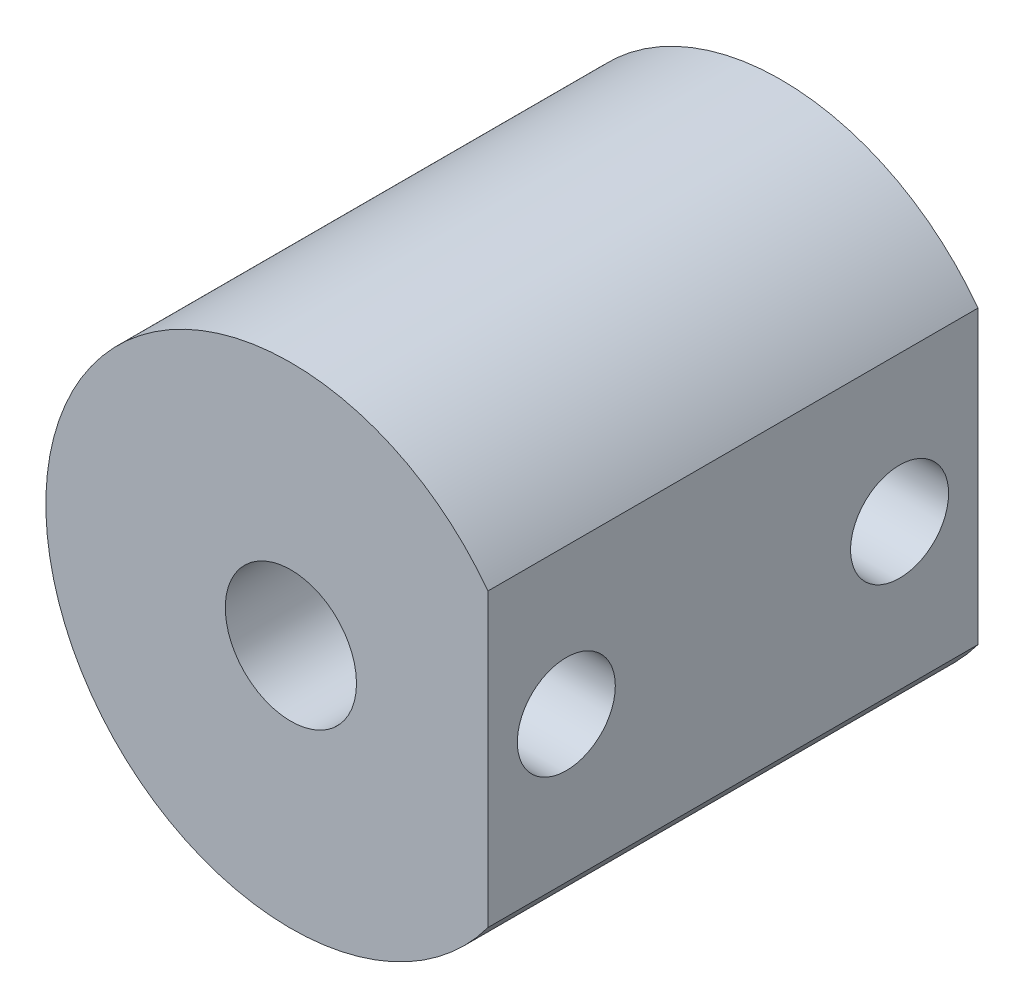
ISO-10303-21;
HEADER;
FILE_DESCRIPTION(('STEP AP214'),'2;1');
FILE_NAME('part.step','',(''),(''),'','','');
FILE_SCHEMA(('AUTOMOTIVE_DESIGN { 1 0 10303 214 1 1 1 1 }'));
ENDSEC;
DATA;
#1=APPLICATION_CONTEXT('core data for automotive mechanical design processes');
#2=APPLICATION_PROTOCOL_DEFINITION('international standard','automotive_design',2000,#1);
#3=PRODUCT_CONTEXT('',#1,'mechanical');
#4=PRODUCT('Part','Part','',(#3));
#5=PRODUCT_RELATED_PRODUCT_CATEGORY('part','',(#4));
#6=PRODUCT_DEFINITION_FORMATION('','',#4);
#7=PRODUCT_DEFINITION_CONTEXT('part definition',#1,'design');
#8=PRODUCT_DEFINITION('design','',#6,#7);
#9=PRODUCT_DEFINITION_SHAPE('','',#8);
#10=(LENGTH_UNIT() NAMED_UNIT(*) SI_UNIT(.MILLI.,.METRE.));
#11=(NAMED_UNIT(*) PLANE_ANGLE_UNIT() SI_UNIT($,.RADIAN.));
#12=(NAMED_UNIT(*) SI_UNIT($,.STERADIAN.) SOLID_ANGLE_UNIT());
#13=UNCERTAINTY_MEASURE_WITH_UNIT(LENGTH_MEASURE(1.E-05),#10,'distance_accuracy_value','');
#14=(GEOMETRIC_REPRESENTATION_CONTEXT(3) GLOBAL_UNCERTAINTY_ASSIGNED_CONTEXT((#13)) GLOBAL_UNIT_ASSIGNED_CONTEXT((#10,
#11,#12)) REPRESENTATION_CONTEXT('',''));
#15=CARTESIAN_POINT('',(0.,0.,0.));
#16=DIRECTION('',(0.,0.,1.));
#17=DIRECTION('',(1.,0.,0.));
#18=AXIS2_PLACEMENT_3D('',#15,#16,#17);
#19=CARTESIAN_POINT('',(0.,0.,6.35));
#20=DIRECTION('',(0.,0.,1.));
#21=DIRECTION('',(1.,0.,0.));
#22=AXIS2_PLACEMENT_3D('',#19,#20,#21);
#23=CYLINDRICAL_SURFACE('',#22,1.7);
#24=CARTESIAN_POINT('',(0.,0.,12.7));
#25=DIRECTION('',(0.,0.,1.));
#26=DIRECTION('',(1.,0.,0.));
#27=AXIS2_PLACEMENT_3D('',#24,#25,#26);
#28=CIRCLE('',#27,1.7);
#29=CARTESIAN_POINT('',(1.7,0.,12.7));
#30=VERTEX_POINT('',#29);
#31=EDGE_CURVE('E208',#30,#30,#28,.T.);
#32=ORIENTED_EDGE('',*,*,#31,.T.);
#33=EDGE_LOOP('',(#32));
#34=FACE_BOUND('',#33,.T.);
#35=CARTESIAN_POINT('',(0.,0.,6.35));
#36=DIRECTION('',(0.,0.,1.));
#37=DIRECTION('',(1.,0.,0.));
#38=AXIS2_PLACEMENT_3D('',#35,#36,#37);
#39=CIRCLE('',#38,1.7);
#40=CARTESIAN_POINT('',(1.7,0.,6.35));
#41=VERTEX_POINT('',#40);
#42=EDGE_CURVE('E211',#41,#41,#39,.T.);
#43=ORIENTED_EDGE('',*,*,#42,.F.);
#44=EDGE_LOOP('',(#43));
#45=FACE_BOUND('',#44,.T.);
#46=DIRECTION('',(0.,0.,1.));
#47=VECTOR('',#46,1.);
#48=CARTESIAN_POINT('',(1.2951946017097,1.10112258341297,6.35));
#49=LINE('',#48,#47);
#50=CARTESIAN_POINT('',(1.2951946017097,1.10112258341297,11.3007946399093));
#51=VERTEX_POINT('',#50);
#52=CARTESIAN_POINT('',(1.2951946017097,1.10112258341297,10.0352053600907));
#53=VERTEX_POINT('',#52);
#54=EDGE_CURVE('E11',#51,#53,#49,.F.);
#55=ORIENTED_EDGE('',*,*,#54,.F.);
#56=CARTESIAN_POINT('',(1.2951946017097,1.10112258341297,11.3007946399093));
#57=CARTESIAN_POINT('',(1.3113173687256,1.08216613180387,11.3337619197842));
#58=CARTESIAN_POINT('',(1.32787279571371,1.06184189359938,11.3657178927191));
#59=CARTESIAN_POINT('',(1.36137730272647,1.01852680407991,11.4275624808981));
#60=CARTESIAN_POINT('',(1.37832646814451,0.995535369906923,11.45745064198));
#61=CARTESIAN_POINT('',(1.41232141435796,0.946701619108911,11.5154108652147));
#62=CARTESIAN_POINT('',(1.42936626934783,0.920831262074049,11.5434598977748));
#63=CARTESIAN_POINT('',(1.46293509373535,0.866511129944811,11.5972581339285));
#64=CARTESIAN_POINT('',(1.47945908547812,0.838061465706677,11.6230074362681));
#65=CARTESIAN_POINT('',(1.52774249560604,0.748722638253251,11.696730436916));
#66=CARTESIAN_POINT('',(1.55813524484959,0.683951000967624,11.7410508948931));
#67=CARTESIAN_POINT('',(1.61184761600013,0.545361428989942,11.8176482286547));
#68=CARTESIAN_POINT('',(1.6352037706125,0.471593113324176,11.8499875170762));
#69=CARTESIAN_POINT('',(1.66668877775104,0.339598467941695,11.8931109365594));
#70=CARTESIAN_POINT('',(1.67727138425101,0.283103462620614,11.9074298176562));
#71=CARTESIAN_POINT('',(1.69268433558115,0.167893711182328,11.9282104668643));
#72=CARTESIAN_POINT('',(1.69751575531143,0.109179381975218,11.9346737032049));
#73=CARTESIAN_POINT('',(1.70100385596444,-0.00885758387635066,11.9393443321602));
#74=CARTESIAN_POINT('',(1.6996506015261,-0.0681810464494508,11.9375384408375));
#75=CARTESIAN_POINT('',(1.69086890222751,-0.185546160427944,11.9257570514304));
#76=CARTESIAN_POINT('',(1.68343948236335,-0.243587604580728,11.91578024221));
#77=CARTESIAN_POINT('',(1.66333003888365,-0.355691032554889,11.8885119373664));
#78=CARTESIAN_POINT('',(1.65075643217894,-0.409808915959445,11.8713685474691));
#79=CARTESIAN_POINT('',(1.62126304690074,-0.51425197559634,11.8305797762669));
#80=CARTESIAN_POINT('',(1.60434205153392,-0.564576084878069,11.8069325744754));
#81=CARTESIAN_POINT('',(1.56491177405399,-0.666630410538083,11.7507279904886));
#82=CARTESIAN_POINT('',(1.54197318693177,-0.717787690111496,11.7174368497656));
#83=CARTESIAN_POINT('',(1.49338732450105,-0.814069541165105,11.6446464234165));
#84=CARTESIAN_POINT('',(1.46773740934434,-0.859188134504203,11.6051410687988));
#85=CARTESIAN_POINT('',(1.41716784401171,-0.940071640037859,11.5237007181589));
#86=CARTESIAN_POINT('',(1.39233043272054,-0.976277877811575,11.4821505052677));
#87=CARTESIAN_POINT('',(1.34310354445216,-1.0429796213762,11.3946932034082));
#88=CARTESIAN_POINT('',(1.318712950277,-1.07349187716099,11.3487995117827));
#89=CARTESIAN_POINT('',(1.2951946017097,-1.10112258341297,11.3007946399093));
#90=B_SPLINE_CURVE_WITH_KNOTS('',3,(#56,#57,#58,#59,#60,#61,#62,#63,#64,#65,#66,#67,#68,#69,#70,
#71,#72,#73,#74,#75,#76,#77,#78,#79,#80,#81,#82,#83,#84,#85,#86,#87,#88,#89),.UNSPECIFIED.,.F.,
.F.,(4,2,2,2,2,2,2,2,2,2,2,2,2,2,2,2,4),(0.,0.123863180300836,0.247753479391506,
0.372978247877537,0.49819763686777,0.749183258251209,0.998842415639397,1.17578456463396,
1.35269363784413,1.52988700619039,1.70710881321811,1.88083625812305,2.05461238078352,
2.24951645474449,2.44461207353285,2.625539738844,2.80592647678083),.UNSPECIFIED.);
#91=CARTESIAN_POINT('',(1.2951946017097,-1.10112258341297,11.3007946399093));
#92=VERTEX_POINT('',#91);
#93=EDGE_CURVE('E126',#51,#92,#90,.T.);
#94=ORIENTED_EDGE('',*,*,#93,.T.);
#95=DIRECTION('',(0.,0.,1.));
#96=VECTOR('',#95,1.);
#97=CARTESIAN_POINT('',(1.2951946017097,-1.10112258341297,6.35));
#98=LINE('',#97,#96);
#99=CARTESIAN_POINT('',(1.2951946017097,-1.10112258341297,10.0352053600907));
#100=VERTEX_POINT('',#99);
#101=EDGE_CURVE('E48',#100,#92,#98,.T.);
#102=ORIENTED_EDGE('',*,*,#101,.F.);
#103=CARTESIAN_POINT('',(1.2951946017097,-1.10112258341297,10.0352053600907));
#104=CARTESIAN_POINT('',(1.3113173687256,-1.08216613180387,10.0022380802159));
#105=CARTESIAN_POINT('',(1.32787279571371,-1.06184189359938,9.97028210728091));
#106=CARTESIAN_POINT('',(1.36137730272647,-1.01852680407991,9.90843751910186));
#107=CARTESIAN_POINT('',(1.37832646814451,-0.995535369906923,9.87854935801997));
#108=CARTESIAN_POINT('',(1.41232141435796,-0.946701619108911,9.82058913478527));
#109=CARTESIAN_POINT('',(1.42936626934783,-0.920831262074049,9.79254010222524));
#110=CARTESIAN_POINT('',(1.46293509373535,-0.866511129944811,9.73874186607155));
#111=CARTESIAN_POINT('',(1.47945908547812,-0.838061465706677,9.71299256373194));
#112=CARTESIAN_POINT('',(1.52774249560604,-0.748722638253251,9.63926956308404));
#113=CARTESIAN_POINT('',(1.55813524484959,-0.683951000967624,9.59494910510688));
#114=CARTESIAN_POINT('',(1.61184761600013,-0.545361428989942,9.51835177134534));
#115=CARTESIAN_POINT('',(1.6352037706125,-0.471593113324176,9.48601248292378));
#116=CARTESIAN_POINT('',(1.66668877775104,-0.339598467941695,9.44288906344059));
#117=CARTESIAN_POINT('',(1.67727138425101,-0.283103462620614,9.42857018234377));
#118=CARTESIAN_POINT('',(1.69268433558115,-0.167893711182328,9.40778953313566));
#119=CARTESIAN_POINT('',(1.69751575531143,-0.109179381975218,9.40132629679508));
#120=CARTESIAN_POINT('',(1.70100385596444,0.00885758387635066,9.39665566783984));
#121=CARTESIAN_POINT('',(1.6996506015261,0.0681810464494508,9.39846155916254));
#122=CARTESIAN_POINT('',(1.69086890222751,0.185546160427944,9.4102429485696));
#123=CARTESIAN_POINT('',(1.68343948236335,0.243587604580728,9.42021975778995));
#124=CARTESIAN_POINT('',(1.66333003888365,0.355691032554889,9.44748806263355));
#125=CARTESIAN_POINT('',(1.65075643217894,0.409808915959445,9.46463145253094));
#126=CARTESIAN_POINT('',(1.62126304690074,0.51425197559634,9.50542022373306));
#127=CARTESIAN_POINT('',(1.60434205153392,0.564576084878069,9.52906742552461));
#128=CARTESIAN_POINT('',(1.56491177405399,0.666630410538083,9.58527200951145));
#129=CARTESIAN_POINT('',(1.54197318693177,0.717787690111496,9.61856315023443));
#130=CARTESIAN_POINT('',(1.49338732450105,0.814069541165105,9.69135357658346));
#131=CARTESIAN_POINT('',(1.46773740934434,0.859188134504203,9.73085893120118));
#132=CARTESIAN_POINT('',(1.41716784401171,0.940071640037859,9.8122992818411));
#133=CARTESIAN_POINT('',(1.39233043272054,0.976277877811575,9.8538494947323));
#134=CARTESIAN_POINT('',(1.34310354445216,1.0429796213762,9.94130679659184));
#135=CARTESIAN_POINT('',(1.318712950277,1.07349187716099,9.98720048821733));
#136=CARTESIAN_POINT('',(1.2951946017097,1.10112258341297,10.0352053600907));
#137=B_SPLINE_CURVE_WITH_KNOTS('',3,(#103,#104,#105,#106,#107,#108,#109,#110,#111,#112,#113,
#114,#115,#116,#117,#118,#119,#120,#121,#122,#123,#124,#125,#126,#127,#128,#129,#130,#131,#132,
#133,#134,#135,#136),.UNSPECIFIED.,.F.,.F.,(4,2,2,2,2,2,2,2,2,2,2,2,2,2,2,2,4),(0.,
0.123863180300834,0.247753479391506,0.372978247877537,0.49819763686777,0.749183258251209,
0.998842415639397,1.17578456463396,1.35269363784413,1.52988700619039,1.70710881321811,
1.88083625812305,2.05461238078352,2.24951645474449,2.44461207353285,2.625539738844,
2.80592647678083),.UNSPECIFIED.);
#138=EDGE_CURVE('E124',#100,#53,#137,.T.);
#139=ORIENTED_EDGE('',*,*,#138,.T.);
#140=EDGE_LOOP('',(#55,#94,#102,#139));
#141=FACE_BOUND('',#140,.T.);
#142=ADVANCED_FACE('F39',(#34,#45,#141),#23,.F.);
#143=CARTESIAN_POINT('',(0.,0.,12.7));
#144=DIRECTION('',(0.,0.,-1.));
#145=DIRECTION('',(-1.,0.,0.));
#146=AXIS2_PLACEMENT_3D('',#143,#144,#145);
#147=CYLINDRICAL_SURFACE('',#146,6.35);
#148=CARTESIAN_POINT('',(0.,0.,12.7));
#149=DIRECTION('',(0.,0.,1.));
#150=DIRECTION('',(1.,0.,0.));
#151=AXIS2_PLACEMENT_3D('',#148,#149,#150);
#152=CIRCLE('',#151,6.35);
#153=CARTESIAN_POINT('',(5.1051946017097,3.77617373523441,12.7));
#154=VERTEX_POINT('',#153);
#155=CARTESIAN_POINT('',(5.1051946017097,-3.77617373523441,12.7));
#156=VERTEX_POINT('',#155);
#157=EDGE_CURVE('E226',#154,#156,#152,.T.);
#158=ORIENTED_EDGE('',*,*,#157,.F.);
#159=DIRECTION('',(0.,0.,-1.));
#160=VECTOR('',#159,1.);
#161=CARTESIAN_POINT('',(5.1051946017097,3.77617373523441,12.7));
#162=LINE('',#161,#160);
#163=CARTESIAN_POINT('',(5.1051946017097,3.77617373523441,0.));
#164=VERTEX_POINT('',#163);
#165=EDGE_CURVE('E247',#154,#164,#162,.T.);
#166=ORIENTED_EDGE('',*,*,#165,.T.);
#167=CARTESIAN_POINT('',(0.,0.,0.));
#168=DIRECTION('',(0.,0.,1.));
#169=DIRECTION('',(1.,0.,0.));
#170=AXIS2_PLACEMENT_3D('',#167,#168,#169);
#171=CIRCLE('',#170,6.35);
#172=CARTESIAN_POINT('',(5.1051946017097,-3.77617373523441,0.));
#173=VERTEX_POINT('',#172);
#174=EDGE_CURVE('E218',#164,#173,#171,.T.);
#175=ORIENTED_EDGE('',*,*,#174,.T.);
#176=DIRECTION('',(0.,0.,-1.));
#177=VECTOR('',#176,1.);
#178=CARTESIAN_POINT('',(5.1051946017097,-3.77617373523441,14.224));
#179=LINE('',#178,#177);
#180=EDGE_CURVE('E62',#156,#173,#179,.T.);
#181=ORIENTED_EDGE('',*,*,#180,.F.);
#182=EDGE_LOOP('',(#158,#166,#175,#181));
#183=FACE_BOUND('',#182,.T.);
#184=ADVANCED_FACE('F41',(#183),#147,.T.);
#185=CARTESIAN_POINT('',(0.,0.,12.7));
#186=DIRECTION('',(0.,0.,1.));
#187=DIRECTION('',(1.,0.,0.));
#188=AXIS2_PLACEMENT_3D('',#185,#186,#187);
#189=PLANE('',#188);
#190=DIRECTION('',(0.,-1.,0.));
#191=VECTOR('',#190,1.);
#192=CARTESIAN_POINT('',(5.1051946017097,0.,12.7));
#193=LINE('',#192,#191);
#194=EDGE_CURVE('E245',#154,#156,#193,.T.);
#195=ORIENTED_EDGE('',*,*,#194,.F.);
#196=ORIENTED_EDGE('',*,*,#157,.T.);
#197=EDGE_LOOP('',(#195,#196));
#198=FACE_BOUND('',#197,.T.);
#199=ORIENTED_EDGE('',*,*,#31,.F.);
#200=EDGE_LOOP('',(#199));
#201=FACE_BOUND('',#200,.T.);
#202=ADVANCED_FACE('F203',(#198,#201),#189,.T.);
#203=CARTESIAN_POINT('',(0.,0.,0.));
#204=DIRECTION('',(0.,0.,1.));
#205=DIRECTION('',(1.,0.,0.));
#206=AXIS2_PLACEMENT_3D('',#203,#204,#205);
#207=PLANE('',#206);
#208=DIRECTION('',(-0.867256587504201,-0.497861437983069,0.));
#209=VECTOR('',#208,1.);
#210=CARTESIAN_POINT('',(2.646216494923,-1.53651280350369,0.));
#211=LINE('',#210,#209);
#212=CARTESIAN_POINT('',(2.646216494923,-1.53651280350369,0.));
#213=VERTEX_POINT('',#212);
#214=CARTESIAN_POINT('',(-0.00755087361273812,-3.05994711026858,0.));
#215=VERTEX_POINT('',#214);
#216=EDGE_CURVE('E268',#213,#215,#211,.T.);
#217=ORIENTED_EDGE('',*,*,#216,.F.);
#218=DIRECTION('',(-0.00246764089411252,-0.999996955369574,0.));
#219=VECTOR('',#218,1.);
#220=CARTESIAN_POINT('',(2.65376736853574,1.52343430676489,0.));
#221=LINE('',#220,#219);
#222=CARTESIAN_POINT('',(2.65376736853574,1.52343430676489,0.));
#223=VERTEX_POINT('',#222);
#224=EDGE_CURVE('E273',#223,#213,#221,.T.);
#225=ORIENTED_EDGE('',*,*,#224,.F.);
#226=DIRECTION('',(0.864788946610088,-0.502135517386506,0.));
#227=VECTOR('',#226,1.);
#228=CARTESIAN_POINT('',(0.00755087361273926,3.05994711026858,0.));
#229=LINE('',#228,#227);
#230=CARTESIAN_POINT('',(0.00755087361273926,3.05994711026858,0.));
#231=VERTEX_POINT('',#230);
#232=EDGE_CURVE('E279',#231,#223,#229,.T.);
#233=ORIENTED_EDGE('',*,*,#232,.F.);
#234=DIRECTION('',(0.867256587504201,0.497861437983068,0.));
#235=VECTOR('',#234,1.);
#236=CARTESIAN_POINT('',(-2.646216494923,1.53651280350369,0.));
#237=LINE('',#236,#235);
#238=CARTESIAN_POINT('',(-2.646216494923,1.53651280350369,0.));
#239=VERTEX_POINT('',#238);
#240=EDGE_CURVE('E311',#239,#231,#237,.T.);
#241=ORIENTED_EDGE('',*,*,#240,.F.);
#242=DIRECTION('',(0.00246764089411266,0.999996955369574,0.));
#243=VECTOR('',#242,1.);
#244=CARTESIAN_POINT('',(-2.65376736853574,-1.52343430676489,0.));
#245=LINE('',#244,#243);
#246=CARTESIAN_POINT('',(-2.65376736853574,-1.52343430676489,0.));
#247=VERTEX_POINT('',#246);
#248=EDGE_CURVE('E307',#247,#239,#245,.T.);
#249=ORIENTED_EDGE('',*,*,#248,.F.);
#250=DIRECTION('',(-0.864788946610088,0.502135517386506,0.));
#251=VECTOR('',#250,1.);
#252=CARTESIAN_POINT('',(-0.00755087361273812,-3.05994711026858,0.));
#253=LINE('',#252,#251);
#254=EDGE_CURVE('E303',#215,#247,#253,.T.);
#255=ORIENTED_EDGE('',*,*,#254,.F.);
#256=EDGE_LOOP('',(#217,#225,#233,#241,#249,#255));
#257=FACE_BOUND('',#256,.T.);
#258=ORIENTED_EDGE('',*,*,#174,.F.);
#259=DIRECTION('',(0.,1.,0.));
#260=VECTOR('',#259,1.);
#261=CARTESIAN_POINT('',(5.1051946017097,-3.77617373523441,0.));
#262=LINE('',#261,#260);
#263=EDGE_CURVE('E134',#173,#164,#262,.T.);
#264=ORIENTED_EDGE('',*,*,#263,.F.);
#265=EDGE_LOOP('',(#258,#264));
#266=FACE_BOUND('',#265,.T.);
#267=ADVANCED_FACE('F173',(#257,#266),#207,.F.);
#268=CARTESIAN_POINT('',(0.,0.,6.35));
#269=DIRECTION('',(0.,0.,-1.));
#270=DIRECTION('',(-1.,0.,0.));
#271=AXIS2_PLACEMENT_3D('',#268,#269,#270);
#272=PLANE('',#271);
#273=DIRECTION('',(-0.00246764089411252,-0.999996955369574,0.));
#274=VECTOR('',#273,1.);
#275=CARTESIAN_POINT('',(2.65376736853574,1.52343430676489,6.35));
#276=LINE('',#275,#274);
#277=CARTESIAN_POINT('',(2.65376736853574,1.52343430676489,6.35));
#278=VERTEX_POINT('',#277);
#279=CARTESIAN_POINT('',(2.646216494923,-1.53651280350369,6.35));
#280=VERTEX_POINT('',#279);
#281=EDGE_CURVE('E274',#278,#280,#276,.T.);
#282=ORIENTED_EDGE('',*,*,#281,.T.);
#283=DIRECTION('',(-0.867256587504201,-0.497861437983069,0.));
#284=VECTOR('',#283,1.);
#285=CARTESIAN_POINT('',(2.646216494923,-1.53651280350369,6.35));
#286=LINE('',#285,#284);
#287=CARTESIAN_POINT('',(-0.00755087361273812,-3.05994711026858,6.35));
#288=VERTEX_POINT('',#287);
#289=EDGE_CURVE('E278',#280,#288,#286,.T.);
#290=ORIENTED_EDGE('',*,*,#289,.T.);
#291=DIRECTION('',(-0.864788946610088,0.502135517386506,0.));
#292=VECTOR('',#291,1.);
#293=CARTESIAN_POINT('',(-0.00755087361273812,-3.05994711026858,6.35));
#294=LINE('',#293,#292);
#295=CARTESIAN_POINT('',(-2.65376736853574,-1.52343430676489,6.35));
#296=VERTEX_POINT('',#295);
#297=EDGE_CURVE('E283',#288,#296,#294,.T.);
#298=ORIENTED_EDGE('',*,*,#297,.T.);
#299=DIRECTION('',(0.00246764089411266,0.999996955369574,0.));
#300=VECTOR('',#299,1.);
#301=CARTESIAN_POINT('',(-2.65376736853574,-1.52343430676489,6.35));
#302=LINE('',#301,#300);
#303=CARTESIAN_POINT('',(-2.646216494923,1.53651280350369,6.35));
#304=VERTEX_POINT('',#303);
#305=EDGE_CURVE('E287',#296,#304,#302,.T.);
#306=ORIENTED_EDGE('',*,*,#305,.T.);
#307=DIRECTION('',(0.867256587504201,0.497861437983068,0.));
#308=VECTOR('',#307,1.);
#309=CARTESIAN_POINT('',(-2.646216494923,1.53651280350369,6.35));
#310=LINE('',#309,#308);
#311=CARTESIAN_POINT('',(0.00755087361273926,3.05994711026858,6.35));
#312=VERTEX_POINT('',#311);
#313=EDGE_CURVE('E291',#304,#312,#310,.T.);
#314=ORIENTED_EDGE('',*,*,#313,.T.);
#315=DIRECTION('',(0.864788946610088,-0.502135517386506,0.));
#316=VECTOR('',#315,1.);
#317=CARTESIAN_POINT('',(0.00755087361273926,3.05994711026858,6.35));
#318=LINE('',#317,#316);
#319=EDGE_CURVE('E295',#312,#278,#318,.T.);
#320=ORIENTED_EDGE('',*,*,#319,.T.);
#321=EDGE_LOOP('',(#282,#290,#298,#306,#314,#320));
#322=FACE_BOUND('',#321,.T.);
#323=ORIENTED_EDGE('',*,*,#42,.T.);
#324=EDGE_LOOP('',(#323));
#325=FACE_BOUND('',#324,.T.);
#326=ADVANCED_FACE('F169',(#322,#325),#272,.T.);
#327=CARTESIAN_POINT('',(2.65376736853574,1.52343430676489,6.35));
#328=DIRECTION('',(0.999996955369574,-0.00246764089411252,0.));
#329=DIRECTION('',(0.00246764089411252,0.999996955369574,0.));
#330=AXIS2_PLACEMENT_3D('',#327,#328,#329);
#331=PLANE('',#330);
#332=CARTESIAN_POINT('',(2.65000806829519,0.,2.032));
#333=DIRECTION('',(0.999996955369574,-0.00246764089411252,0.));
#334=DIRECTION('',(0.00246764089411252,0.999996955369574,0.));
#335=AXIS2_PLACEMENT_3D('',#332,#333,#334);
#336=ELLIPSE('',#335,1.27000386669241,1.27);
#337=CARTESIAN_POINT('',(2.65314198177233,1.27,2.032));
#338=VERTEX_POINT('',#337);
#339=EDGE_CURVE('E128',#338,#338,#336,.T.);
#340=ORIENTED_EDGE('',*,*,#339,.T.);
#341=EDGE_LOOP('',(#340));
#342=FACE_BOUND('',#341,.T.);
#343=ORIENTED_EDGE('',*,*,#224,.T.);
#344=DIRECTION('',(0.,0.,-1.));
#345=VECTOR('',#344,1.);
#346=CARTESIAN_POINT('',(2.646216494923,-1.53651280350369,6.35));
#347=LINE('',#346,#345);
#348=EDGE_CURVE('E223',#280,#213,#347,.T.);
#349=ORIENTED_EDGE('',*,*,#348,.F.);
#350=ORIENTED_EDGE('',*,*,#281,.F.);
#351=DIRECTION('',(0.,0.,-1.));
#352=VECTOR('',#351,1.);
#353=CARTESIAN_POINT('',(2.65376736853574,1.52343430676489,6.35));
#354=LINE('',#353,#352);
#355=EDGE_CURVE('E214',#278,#223,#354,.T.);
#356=ORIENTED_EDGE('',*,*,#355,.T.);
#357=EDGE_LOOP('',(#343,#349,#350,#356));
#358=FACE_BOUND('',#357,.T.);
#359=ADVANCED_FACE('F172',(#342,#358),#331,.F.);
#360=CARTESIAN_POINT('',(0.00755087361273926,3.05994711026858,6.35));
#361=DIRECTION('',(0.502135517386506,0.864788946610088,0.));
#362=DIRECTION('',(-0.864788946610088,0.502135517386506,0.));
#363=AXIS2_PLACEMENT_3D('',#360,#361,#362);
#364=PLANE('',#363);
#365=ORIENTED_EDGE('',*,*,#232,.T.);
#366=ORIENTED_EDGE('',*,*,#355,.F.);
#367=ORIENTED_EDGE('',*,*,#319,.F.);
#368=DIRECTION('',(0.,0.,-1.));
#369=VECTOR('',#368,1.);
#370=CARTESIAN_POINT('',(0.00755087361273926,3.05994711026858,6.35));
#371=LINE('',#370,#369);
#372=EDGE_CURVE('E220',#312,#231,#371,.T.);
#373=ORIENTED_EDGE('',*,*,#372,.T.);
#374=EDGE_LOOP('',(#365,#366,#367,#373));
#375=FACE_BOUND('',#374,.T.);
#376=ADVANCED_FACE('F175',(#375),#364,.F.);
#377=CARTESIAN_POINT('',(-2.646216494923,1.53651280350369,6.35));
#378=DIRECTION('',(-0.497861437983068,0.867256587504201,0.));
#379=DIRECTION('',(-0.867256587504201,-0.497861437983068,0.));
#380=AXIS2_PLACEMENT_3D('',#377,#378,#379);
#381=PLANE('',#380);
#382=ORIENTED_EDGE('',*,*,#240,.T.);
#383=ORIENTED_EDGE('',*,*,#372,.F.);
#384=ORIENTED_EDGE('',*,*,#313,.F.);
#385=DIRECTION('',(0.,0.,-1.));
#386=VECTOR('',#385,1.);
#387=CARTESIAN_POINT('',(-2.646216494923,1.53651280350369,6.35));
#388=LINE('',#387,#386);
#389=EDGE_CURVE('E320',#304,#239,#388,.T.);
#390=ORIENTED_EDGE('',*,*,#389,.T.);
#391=EDGE_LOOP('',(#382,#383,#384,#390));
#392=FACE_BOUND('',#391,.T.);
#393=ADVANCED_FACE('F178',(#392),#381,.F.);
#394=CARTESIAN_POINT('',(-2.65376736853574,-1.52343430676489,6.35));
#395=DIRECTION('',(-0.999996955369574,0.00246764089411266,0.));
#396=DIRECTION('',(-0.00246764089411266,-0.999996955369574,0.));
#397=AXIS2_PLACEMENT_3D('',#394,#395,#396);
#398=PLANE('',#397);
#399=ORIENTED_EDGE('',*,*,#248,.T.);
#400=ORIENTED_EDGE('',*,*,#389,.F.);
#401=ORIENTED_EDGE('',*,*,#305,.F.);
#402=DIRECTION('',(0.,0.,-1.));
#403=VECTOR('',#402,1.);
#404=CARTESIAN_POINT('',(-2.65376736853574,-1.52343430676489,6.35));
#405=LINE('',#404,#403);
#406=EDGE_CURVE('E323',#296,#247,#405,.T.);
#407=ORIENTED_EDGE('',*,*,#406,.T.);
#408=EDGE_LOOP('',(#399,#400,#401,#407));
#409=FACE_BOUND('',#408,.T.);
#410=ADVANCED_FACE('F182',(#409),#398,.F.);
#411=CARTESIAN_POINT('',(-0.00755087361273812,-3.05994711026858,6.35));
#412=DIRECTION('',(-0.502135517386506,-0.864788946610088,0.));
#413=DIRECTION('',(0.864788946610088,-0.502135517386506,0.));
#414=AXIS2_PLACEMENT_3D('',#411,#412,#413);
#415=PLANE('',#414);
#416=ORIENTED_EDGE('',*,*,#254,.T.);
#417=ORIENTED_EDGE('',*,*,#406,.F.);
#418=ORIENTED_EDGE('',*,*,#297,.F.);
#419=DIRECTION('',(0.,0.,-1.));
#420=VECTOR('',#419,1.);
#421=CARTESIAN_POINT('',(-0.00755087361273812,-3.05994711026858,6.35));
#422=LINE('',#421,#420);
#423=EDGE_CURVE('E325',#288,#215,#422,.T.);
#424=ORIENTED_EDGE('',*,*,#423,.T.);
#425=EDGE_LOOP('',(#416,#417,#418,#424));
#426=FACE_BOUND('',#425,.T.);
#427=ADVANCED_FACE('F186',(#426),#415,.F.);
#428=CARTESIAN_POINT('',(2.646216494923,-1.53651280350369,6.35));
#429=DIRECTION('',(0.497861437983069,-0.867256587504201,0.));
#430=DIRECTION('',(0.867256587504201,0.497861437983069,0.));
#431=AXIS2_PLACEMENT_3D('',#428,#429,#430);
#432=PLANE('',#431);
#433=ORIENTED_EDGE('',*,*,#216,.T.);
#434=ORIENTED_EDGE('',*,*,#423,.F.);
#435=ORIENTED_EDGE('',*,*,#289,.F.);
#436=ORIENTED_EDGE('',*,*,#348,.T.);
#437=EDGE_LOOP('',(#433,#434,#435,#436));
#438=FACE_BOUND('',#437,.T.);
#439=ADVANCED_FACE('F167',(#438),#432,.F.);
#440=CARTESIAN_POINT('',(5.1051946017097,-3.77617373523441,14.224));
#441=DIRECTION('',(-1.,0.,0.));
#442=DIRECTION('',(0.,0.,1.));
#443=AXIS2_PLACEMENT_3D('',#440,#441,#442);
#444=PLANE('',#443);
#445=CARTESIAN_POINT('',(5.1051946017097,0.,10.668));
#446=DIRECTION('',(1.,0.,0.));
#447=DIRECTION('',(0.,0.,-1.));
#448=AXIS2_PLACEMENT_3D('',#445,#446,#447);
#449=CIRCLE('',#448,1.27);
#450=CARTESIAN_POINT('',(5.1051946017097,0.,9.398));
#451=VERTEX_POINT('',#450);
#452=EDGE_CURVE('E234',#451,#451,#449,.T.);
#453=ORIENTED_EDGE('',*,*,#452,.F.);
#454=EDGE_LOOP('',(#453));
#455=FACE_BOUND('',#454,.T.);
#456=CARTESIAN_POINT('',(5.1051946017097,0.,2.032));
#457=DIRECTION('',(1.,0.,0.));
#458=DIRECTION('',(0.,0.,-1.));
#459=AXIS2_PLACEMENT_3D('',#456,#457,#458);
#460=CIRCLE('',#459,1.27);
#461=CARTESIAN_POINT('',(5.1051946017097,0.,0.762));
#462=VERTEX_POINT('',#461);
#463=EDGE_CURVE('E237',#462,#462,#460,.T.);
#464=ORIENTED_EDGE('',*,*,#463,.F.);
#465=EDGE_LOOP('',(#464));
#466=FACE_BOUND('',#465,.T.);
#467=ORIENTED_EDGE('',*,*,#194,.T.);
#468=ORIENTED_EDGE('',*,*,#180,.T.);
#469=ORIENTED_EDGE('',*,*,#263,.T.);
#470=ORIENTED_EDGE('',*,*,#165,.F.);
#471=EDGE_LOOP('',(#467,#468,#469,#470));
#472=FACE_BOUND('',#471,.T.);
#473=ADVANCED_FACE('F163',(#455,#466,#472),#444,.F.);
#474=CARTESIAN_POINT('',(1.2951946017097,0.,2.032));
#475=DIRECTION('',(1.,0.,0.));
#476=DIRECTION('',(0.,0.,-1.));
#477=AXIS2_PLACEMENT_3D('',#474,#475,#476);
#478=CYLINDRICAL_SURFACE('',#477,1.27);
#479=ORIENTED_EDGE('',*,*,#463,.T.);
#480=EDGE_LOOP('',(#479));
#481=FACE_BOUND('',#480,.T.);
#482=ORIENTED_EDGE('',*,*,#339,.F.);
#483=EDGE_LOOP('',(#482));
#484=FACE_BOUND('',#483,.T.);
#485=ADVANCED_FACE('F159',(#481,#484),#478,.F.);
#486=CARTESIAN_POINT('',(1.2951946017097,0.,10.668));
#487=DIRECTION('',(1.,0.,0.));
#488=DIRECTION('',(0.,0.,-1.));
#489=AXIS2_PLACEMENT_3D('',#486,#487,#488);
#490=PLANE('',#489);
#491=ORIENTED_EDGE('',*,*,#54,.T.);
#492=CARTESIAN_POINT('',(1.2951946017097,0.,10.668));
#493=DIRECTION('',(1.,0.,0.));
#494=DIRECTION('',(0.,0.,-1.));
#495=AXIS2_PLACEMENT_3D('',#492,#493,#494);
#496=CIRCLE('',#495,1.27);
#497=EDGE_CURVE('E118',#53,#51,#496,.T.);
#498=ORIENTED_EDGE('',*,*,#497,.T.);
#499=EDGE_LOOP('',(#491,#498));
#500=FACE_BOUND('',#499,.T.);
#501=ADVANCED_FACE('F117',(#500),#490,.T.);
#502=ORIENTED_EDGE('',*,*,#101,.T.);
#503=EDGE_CURVE('E54',#92,#100,#496,.T.);
#504=ORIENTED_EDGE('',*,*,#503,.T.);
#505=EDGE_LOOP('',(#502,#504));
#506=FACE_BOUND('',#505,.T.);
#507=ADVANCED_FACE('F157',(#506),#490,.T.);
#508=CARTESIAN_POINT('',(1.2951946017097,0.,10.668));
#509=DIRECTION('',(1.,0.,0.));
#510=DIRECTION('',(0.,0.,-1.));
#511=AXIS2_PLACEMENT_3D('',#508,#509,#510);
#512=CYLINDRICAL_SURFACE('',#511,1.27);
#513=ORIENTED_EDGE('',*,*,#452,.T.);
#514=EDGE_LOOP('',(#513));
#515=FACE_BOUND('',#514,.T.);
#516=ORIENTED_EDGE('',*,*,#497,.F.);
#517=ORIENTED_EDGE('',*,*,#138,.F.);
#518=ORIENTED_EDGE('',*,*,#503,.F.);
#519=ORIENTED_EDGE('',*,*,#93,.F.);
#520=EDGE_LOOP('',(#516,#517,#518,#519));
#521=FACE_BOUND('',#520,.T.);
#522=ADVANCED_FACE('F123',(#515,#521),#512,.F.);
#523=CLOSED_SHELL('',(#142,#184,#202,#267,#326,#359,#376,#393,#410,#427,#439,#473,#485,#501,
#507,#522));
#524=MANIFOLD_SOLID_BREP('B2',#523);
#525=ADVANCED_BREP_SHAPE_REPRESENTATION('',(#18,#524),#14);
#526=SHAPE_DEFINITION_REPRESENTATION(#9,#525);
ENDSEC;
END-ISO-10303-21;
